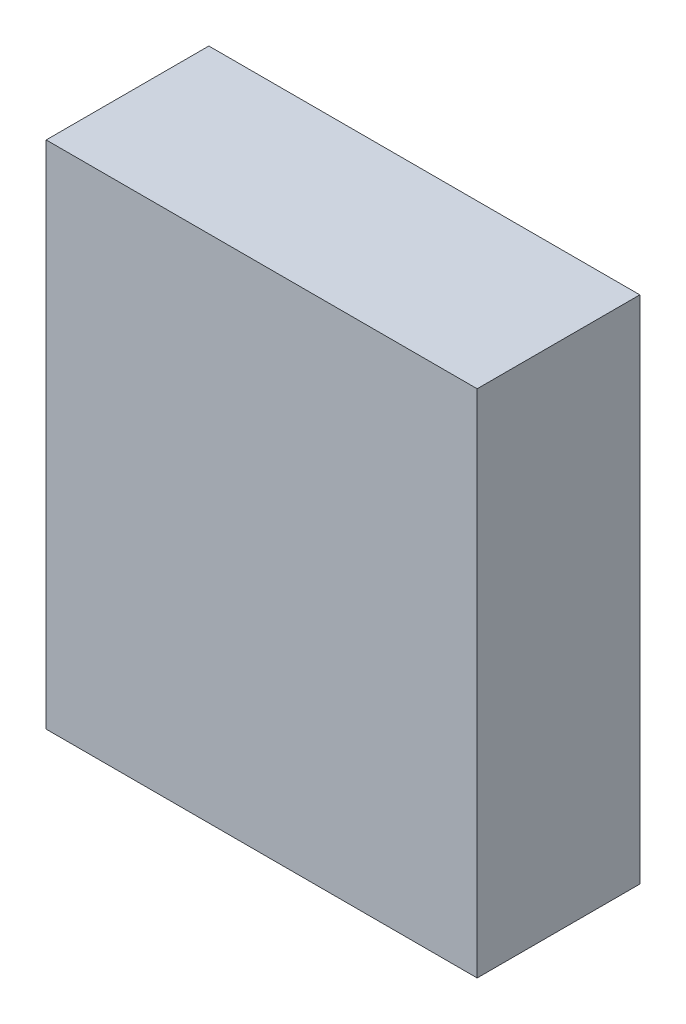
ISO-10303-21;
HEADER;
FILE_DESCRIPTION(('STEP AP214'),'2;1');
FILE_NAME('part.step','',(''),(''),'','','');
FILE_SCHEMA(('AUTOMOTIVE_DESIGN { 1 0 10303 214 1 1 1 1 }'));
ENDSEC;
DATA;
#1=APPLICATION_CONTEXT('core data for automotive mechanical design processes');
#2=APPLICATION_PROTOCOL_DEFINITION('international standard','automotive_design',2000,#1);
#3=PRODUCT_CONTEXT('',#1,'mechanical');
#4=PRODUCT('Part','Part','',(#3));
#5=PRODUCT_RELATED_PRODUCT_CATEGORY('part','',(#4));
#6=PRODUCT_DEFINITION_FORMATION('','',#4);
#7=PRODUCT_DEFINITION_CONTEXT('part definition',#1,'design');
#8=PRODUCT_DEFINITION('design','',#6,#7);
#9=PRODUCT_DEFINITION_SHAPE('','',#8);
#10=(LENGTH_UNIT() NAMED_UNIT(*) SI_UNIT(.MILLI.,.METRE.));
#11=(NAMED_UNIT(*) PLANE_ANGLE_UNIT() SI_UNIT($,.RADIAN.));
#12=(NAMED_UNIT(*) SI_UNIT($,.STERADIAN.) SOLID_ANGLE_UNIT());
#13=UNCERTAINTY_MEASURE_WITH_UNIT(LENGTH_MEASURE(1.E-05),#10,'distance_accuracy_value','');
#14=(GEOMETRIC_REPRESENTATION_CONTEXT(3) GLOBAL_UNCERTAINTY_ASSIGNED_CONTEXT((#13)) GLOBAL_UNIT_ASSIGNED_CONTEXT((#10,
#11,#12)) REPRESENTATION_CONTEXT('',''));
#15=CARTESIAN_POINT('',(0.,0.,0.));
#16=DIRECTION('',(0.,0.,1.));
#17=DIRECTION('',(1.,0.,0.));
#18=AXIS2_PLACEMENT_3D('',#15,#16,#17);
#19=CARTESIAN_POINT('',(0.,0.,6.1));
#20=DIRECTION('',(0.,0.,1.));
#21=DIRECTION('',(1.,0.,0.));
#22=AXIS2_PLACEMENT_3D('',#19,#20,#21);
#23=PLANE('',#22);
#24=DIRECTION('',(0.,1.,0.));
#25=VECTOR('',#24,1.);
#26=CARTESIAN_POINT('',(-8.081,9.846,6.1));
#27=LINE('',#26,#25);
#28=CARTESIAN_POINT('',(-8.081,-9.29,6.1));
#29=VERTEX_POINT('',#28);
#30=CARTESIAN_POINT('',(-8.081,9.846,6.1));
#31=VERTEX_POINT('',#30);
#32=EDGE_CURVE('E68',#29,#31,#27,.T.);
#33=ORIENTED_EDGE('',*,*,#32,.F.);
#34=DIRECTION('',(1.,0.,0.));
#35=VECTOR('',#34,1.);
#36=CARTESIAN_POINT('',(-8.081,-9.29,6.1));
#37=LINE('',#36,#35);
#38=CARTESIAN_POINT('',(8.081,-9.29,6.1));
#39=VERTEX_POINT('',#38);
#40=EDGE_CURVE('E20',#39,#29,#37,.F.);
#41=ORIENTED_EDGE('',*,*,#40,.F.);
#42=DIRECTION('',(0.,1.,0.));
#43=VECTOR('',#42,1.);
#44=CARTESIAN_POINT('',(8.081,-9.29,6.1));
#45=LINE('',#44,#43);
#46=CARTESIAN_POINT('',(8.081,9.846,6.1));
#47=VERTEX_POINT('',#46);
#48=EDGE_CURVE('E58',#47,#39,#45,.F.);
#49=ORIENTED_EDGE('',*,*,#48,.F.);
#50=DIRECTION('',(1.,0.,0.));
#51=VECTOR('',#50,1.);
#52=CARTESIAN_POINT('',(8.081,9.846,6.1));
#53=LINE('',#52,#51);
#54=EDGE_CURVE('E53',#31,#47,#53,.T.);
#55=ORIENTED_EDGE('',*,*,#54,.F.);
#56=EDGE_LOOP('',(#33,#41,#49,#55));
#57=FACE_BOUND('',#56,.T.);
#58=ADVANCED_FACE('F17',(#57),#23,.T.);
#59=CARTESIAN_POINT('',(-8.081,-9.29,0.));
#60=DIRECTION('',(0.,-1.,0.));
#61=DIRECTION('',(0.,0.,-1.));
#62=AXIS2_PLACEMENT_3D('',#59,#60,#61);
#63=PLANE('',#62);
#64=DIRECTION('',(0.,0.,1.));
#65=VECTOR('',#64,1.);
#66=CARTESIAN_POINT('',(-8.081,-9.29,0.));
#67=LINE('',#66,#65);
#68=CARTESIAN_POINT('',(-8.081,-9.29,0.));
#69=VERTEX_POINT('',#68);
#70=EDGE_CURVE('E79',#69,#29,#67,.T.);
#71=ORIENTED_EDGE('',*,*,#70,.F.);
#72=DIRECTION('',(1.,0.,0.));
#73=VECTOR('',#72,1.);
#74=CARTESIAN_POINT('',(0.,-9.29,0.));
#75=LINE('',#74,#73);
#76=CARTESIAN_POINT('',(8.081,-9.29,0.));
#77=VERTEX_POINT('',#76);
#78=EDGE_CURVE('E74',#69,#77,#75,.T.);
#79=ORIENTED_EDGE('',*,*,#78,.T.);
#80=DIRECTION('',(0.,0.,-1.));
#81=VECTOR('',#80,1.);
#82=CARTESIAN_POINT('',(8.081,-9.29,0.));
#83=LINE('',#82,#81);
#84=EDGE_CURVE('E63',#39,#77,#83,.T.);
#85=ORIENTED_EDGE('',*,*,#84,.F.);
#86=ORIENTED_EDGE('',*,*,#40,.T.);
#87=EDGE_LOOP('',(#71,#79,#85,#86));
#88=FACE_BOUND('',#87,.T.);
#89=ADVANCED_FACE('F73',(#88),#63,.T.);
#90=CARTESIAN_POINT('',(8.081,-9.29,0.));
#91=DIRECTION('',(1.,0.,0.));
#92=DIRECTION('',(0.,0.,-1.));
#93=AXIS2_PLACEMENT_3D('',#90,#91,#92);
#94=PLANE('',#93);
#95=ORIENTED_EDGE('',*,*,#84,.T.);
#96=DIRECTION('',(0.,1.,0.));
#97=VECTOR('',#96,1.);
#98=CARTESIAN_POINT('',(8.081,0.,0.));
#99=LINE('',#98,#97);
#100=CARTESIAN_POINT('',(8.081,9.846,0.));
#101=VERTEX_POINT('',#100);
#102=EDGE_CURVE('E84',#77,#101,#99,.T.);
#103=ORIENTED_EDGE('',*,*,#102,.T.);
#104=DIRECTION('',(0.,0.,1.));
#105=VECTOR('',#104,1.);
#106=CARTESIAN_POINT('',(8.081,9.846,0.));
#107=LINE('',#106,#105);
#108=EDGE_CURVE('E65',#47,#101,#107,.F.);
#109=ORIENTED_EDGE('',*,*,#108,.F.);
#110=ORIENTED_EDGE('',*,*,#48,.T.);
#111=EDGE_LOOP('',(#95,#103,#109,#110));
#112=FACE_BOUND('',#111,.T.);
#113=ADVANCED_FACE('F60',(#112),#94,.T.);
#114=CARTESIAN_POINT('',(8.081,9.846,0.));
#115=DIRECTION('',(0.,1.,0.));
#116=DIRECTION('',(0.,0.,1.));
#117=AXIS2_PLACEMENT_3D('',#114,#115,#116);
#118=PLANE('',#117);
#119=ORIENTED_EDGE('',*,*,#108,.T.);
#120=DIRECTION('',(1.,0.,0.));
#121=VECTOR('',#120,1.);
#122=CARTESIAN_POINT('',(0.,9.846,0.));
#123=LINE('',#122,#121);
#124=CARTESIAN_POINT('',(-8.081,9.846,0.));
#125=VERTEX_POINT('',#124);
#126=EDGE_CURVE('E26',#101,#125,#123,.F.);
#127=ORIENTED_EDGE('',*,*,#126,.T.);
#128=DIRECTION('',(0.,0.,1.));
#129=VECTOR('',#128,1.);
#130=CARTESIAN_POINT('',(-8.081,9.846,0.));
#131=LINE('',#130,#129);
#132=EDGE_CURVE('E34',#31,#125,#131,.F.);
#133=ORIENTED_EDGE('',*,*,#132,.F.);
#134=ORIENTED_EDGE('',*,*,#54,.T.);
#135=EDGE_LOOP('',(#119,#127,#133,#134));
#136=FACE_BOUND('',#135,.T.);
#137=ADVANCED_FACE('F88',(#136),#118,.T.);
#138=CARTESIAN_POINT('',(-8.081,9.846,0.));
#139=DIRECTION('',(-1.,0.,0.));
#140=DIRECTION('',(0.,0.,1.));
#141=AXIS2_PLACEMENT_3D('',#138,#139,#140);
#142=PLANE('',#141);
#143=ORIENTED_EDGE('',*,*,#132,.T.);
#144=DIRECTION('',(0.,1.,0.));
#145=VECTOR('',#144,1.);
#146=CARTESIAN_POINT('',(-8.081,0.,0.));
#147=LINE('',#146,#145);
#148=EDGE_CURVE('E11',#125,#69,#147,.F.);
#149=ORIENTED_EDGE('',*,*,#148,.T.);
#150=ORIENTED_EDGE('',*,*,#70,.T.);
#151=ORIENTED_EDGE('',*,*,#32,.T.);
#152=EDGE_LOOP('',(#143,#149,#150,#151));
#153=FACE_BOUND('',#152,.T.);
#154=ADVANCED_FACE('F91',(#153),#142,.T.);
#155=CARTESIAN_POINT('',(0.,0.,0.));
#156=DIRECTION('',(0.,0.,1.));
#157=DIRECTION('',(1.,0.,0.));
#158=AXIS2_PLACEMENT_3D('',#155,#156,#157);
#159=PLANE('',#158);
#160=ORIENTED_EDGE('',*,*,#126,.F.);
#161=ORIENTED_EDGE('',*,*,#102,.F.);
#162=ORIENTED_EDGE('',*,*,#78,.F.);
#163=ORIENTED_EDGE('',*,*,#148,.F.);
#164=EDGE_LOOP('',(#160,#161,#162,#163));
#165=FACE_BOUND('',#164,.T.);
#166=ADVANCED_FACE('F90',(#165),#159,.F.);
#167=CLOSED_SHELL('',(#58,#89,#113,#137,#154,#166));
#168=MANIFOLD_SOLID_BREP('B1',#167);
#169=ADVANCED_BREP_SHAPE_REPRESENTATION('',(#18,#168),#14);
#170=SHAPE_DEFINITION_REPRESENTATION(#9,#169);
ENDSEC;
END-ISO-10303-21;
